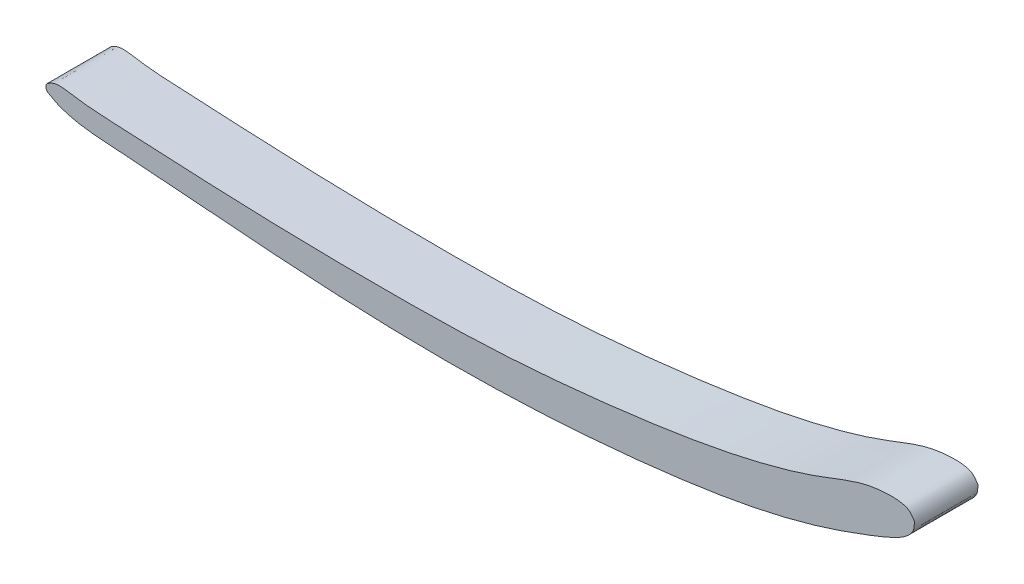
ISO-10303-21;
HEADER;
FILE_DESCRIPTION(('STEP AP214'),'2;1');
FILE_NAME('part.step','',(''),(''),'','','');
FILE_SCHEMA(('AUTOMOTIVE_DESIGN { 1 0 10303 214 1 1 1 1 }'));
ENDSEC;
DATA;
#1=APPLICATION_CONTEXT('core data for automotive mechanical design processes');
#2=APPLICATION_PROTOCOL_DEFINITION('international standard','automotive_design',2000,#1);
#3=PRODUCT_CONTEXT('',#1,'mechanical');
#4=PRODUCT('Part','Part','',(#3));
#5=PRODUCT_RELATED_PRODUCT_CATEGORY('part','',(#4));
#6=PRODUCT_DEFINITION_FORMATION('','',#4);
#7=PRODUCT_DEFINITION_CONTEXT('part definition',#1,'design');
#8=PRODUCT_DEFINITION('design','',#6,#7);
#9=PRODUCT_DEFINITION_SHAPE('','',#8);
#10=(LENGTH_UNIT() NAMED_UNIT(*) SI_UNIT(.MILLI.,.METRE.));
#11=(NAMED_UNIT(*) PLANE_ANGLE_UNIT() SI_UNIT($,.RADIAN.));
#12=(NAMED_UNIT(*) SI_UNIT($,.STERADIAN.) SOLID_ANGLE_UNIT());
#13=UNCERTAINTY_MEASURE_WITH_UNIT(LENGTH_MEASURE(1.E-05),#10,'distance_accuracy_value','');
#14=(GEOMETRIC_REPRESENTATION_CONTEXT(3) GLOBAL_UNCERTAINTY_ASSIGNED_CONTEXT((#13)) GLOBAL_UNIT_ASSIGNED_CONTEXT((#10,
#11,#12)) REPRESENTATION_CONTEXT('',''));
#15=CARTESIAN_POINT('',(0.,0.,0.));
#16=DIRECTION('',(0.,0.,1.));
#17=DIRECTION('',(1.,0.,0.));
#18=AXIS2_PLACEMENT_3D('',#15,#16,#17);
#19=CARTESIAN_POINT('',(39.2107101249076,0.,484.));
#20=CARTESIAN_POINT('',(39.1966892149478,0.0744994993263082,484.));
#21=CARTESIAN_POINT('',(39.1562316590407,0.138319090804084,484.));
#22=CARTESIAN_POINT('',(39.0703347443048,0.260630284760317,484.));
#23=CARTESIAN_POINT('',(39.0237848143283,0.319070404348247,484.));
#24=CARTESIAN_POINT('',(38.8880870892106,0.497370583815167,484.));
#25=CARTESIAN_POINT('',(38.7982872511673,0.617945012896429,484.));
#26=CARTESIAN_POINT('',(38.6452093965495,0.779345719525884,484.));
#27=CARTESIAN_POINT('',(38.5915032725305,0.830090802228872,484.));
#28=CARTESIAN_POINT('',(38.4747754323977,0.920962039986768,484.));
#29=CARTESIAN_POINT('',(38.4116596899818,0.96166063597309,484.));
#30=CARTESIAN_POINT('',(38.213576152383,1.06922299967274,484.));
#31=CARTESIAN_POINT('',(38.0741792380814,1.12009828628752,484.));
#32=CARTESIAN_POINT('',(37.7884118235619,1.20205918468328,484.));
#33=CARTESIAN_POINT('',(37.6413669209037,1.23253707760964,484.));
#34=CARTESIAN_POINT('',(37.348402342913,1.28204351952523,484.));
#35=CARTESIAN_POINT('',(37.2016683670176,1.30074861772526,484.));
#36=CARTESIAN_POINT('',(36.7608035094387,1.34093347904155,484.));
#37=CARTESIAN_POINT('',(36.4660717735677,1.34797450941312,484.));
#38=CARTESIAN_POINT('',(35.5806985864055,1.34079034688117,484.));
#39=CARTESIAN_POINT('',(34.9868344498564,1.2929820434049,484.));
#40=CARTESIAN_POINT('',(33.8223606826979,1.13406301190361,484.));
#41=CARTESIAN_POINT('',(33.2488448021653,1.02005411491131,484.));
#42=CARTESIAN_POINT('',(31.5529642773984,0.580305451016068,484.));
#43=CARTESIAN_POINT('',(30.4527361071637,0.166324137466603,484.));
#44=CARTESIAN_POINT('',(28.2566952339368,-0.676674500100068,484.));
#45=CARTESIAN_POINT('',(27.1582861635171,-1.09688048189664,484.));
#46=CARTESIAN_POINT('',(24.9366697830536,-1.85476622156599,484.));
#47=CARTESIAN_POINT('',(23.8147168674368,-2.19662048686103,484.));
#48=CARTESIAN_POINT('',(21.5560066442277,-2.83106138451655,484.));
#49=CARTESIAN_POINT('',(20.4193296614462,-3.12391533034056,484.));
#50=CARTESIAN_POINT('',(18.1353443383193,-3.67424305758066,484.));
#51=CARTESIAN_POINT('',(16.9869081075183,-3.93026201242336,484.));
#52=CARTESIAN_POINT('',(14.6830237254564,-4.40314981869379,484.));
#53=CARTESIAN_POINT('',(13.5275178329586,-4.62077383124135,484.));
#54=CARTESIAN_POINT('',(10.0528488402235,-5.23059881165078,484.));
#55=CARTESIAN_POINT('',(7.72670971251842,-5.58180834113543,484.));
#56=CARTESIAN_POINT('',(3.06737675596727,-6.2166371996226,484.));
#57=CARTESIAN_POINT('',(0.733006936023503,-6.49849349629658,484.));
#58=CARTESIAN_POINT('',(-3.94390306326162,-7.00043666205528,484.));
#59=CARTESIAN_POINT('',(-6.28559921876976,-7.22060632034208,484.));
#60=CARTESIAN_POINT('',(-10.9759071324191,-7.58063802374168,484.));
#61=CARTESIAN_POINT('',(-13.323045011252,-7.71795290262417,484.));
#62=CARTESIAN_POINT('',(-18.0208983753869,-7.90787918288885,484.));
#63=CARTESIAN_POINT('',(-20.3718961686928,-7.96207679777389,484.));
#64=CARTESIAN_POINT('',(-25.0746237803829,-8.02370895288753,484.));
#65=CARTESIAN_POINT('',(-27.4256594080246,-8.03158361740562,484.));
#66=CARTESIAN_POINT('',(-32.1272992546176,-8.01717516979136,484.));
#67=CARTESIAN_POINT('',(-34.4778991243605,-7.99458802471639,484.));
#68=CARTESIAN_POINT('',(-39.178506252671,-7.90798704137264,484.));
#69=CARTESIAN_POINT('',(-41.5285322433584,-7.84528267853818,484.));
#70=CARTESIAN_POINT('',(-46.2280492219918,-7.68247439755802,484.));
#71=CARTESIAN_POINT('',(-48.5776503223684,-7.5841113475501,484.));
#72=CARTESIAN_POINT('',(-53.2759727165062,-7.37168228432304,484.));
#73=CARTESIAN_POINT('',(-55.6248698802098,-7.25964484015671,484.));
#74=CARTESIAN_POINT('',(-59.1479135583727,-7.08555339602926,484.));
#75=CARTESIAN_POINT('',(-60.3221381970623,-7.02507658041809,484.));
#76=CARTESIAN_POINT('',(-62.0832120252559,-6.92938142464674,484.));
#77=CARTESIAN_POINT('',(-62.670313971126,-6.89876829933132,484.));
#78=CARTESIAN_POINT('',(-63.843876649115,-6.82688567500398,484.));
#79=CARTESIAN_POINT('',(-64.4307159332352,-6.78558512833964,484.));
#80=CARTESIAN_POINT('',(-65.5996269195834,-6.66575239794893,484.));
#81=CARTESIAN_POINT('',(-66.1816473244854,-6.58716981610242,484.));
#82=CARTESIAN_POINT('',(-67.0513434113812,-6.4437351117229,484.));
#83=CARTESIAN_POINT('',(-67.3411695905743,-6.3944391707274,484.));
#84=CARTESIAN_POINT('',(-67.9235695636408,-6.32080670477406,484.));
#85=CARTESIAN_POINT('',(-68.2151163723877,-6.29340025827855,484.));
#86=CARTESIAN_POINT('',(-68.6542919896269,-6.30263037621787,484.));
#87=CARTESIAN_POINT('',(-68.8026862186217,-6.31498472114989,484.));
#88=CARTESIAN_POINT('',(-69.0906644904235,-6.36792942563297,484.));
#89=CARTESIAN_POINT('',(-69.2295109772167,-6.40976423032289,484.));
#90=CARTESIAN_POINT('',(-69.4979470298529,-6.52108670983577,484.));
#91=CARTESIAN_POINT('',(-69.6289048703496,-6.58828177997934,484.));
#92=CARTESIAN_POINT('',(-69.8198169159043,-6.69830648081664,484.));
#93=CARTESIAN_POINT('',(-69.8834270575343,-6.73502547503228,484.));
#94=CARTESIAN_POINT('',(-70.0074703899847,-6.81361231644513,484.));
#95=CARTESIAN_POINT('',(-70.0663552279727,-6.8613333578042,484.));
#96=CARTESIAN_POINT('',(-70.1432948027563,-6.98779597721294,484.));
#97=CARTESIAN_POINT('',(-70.1625574665755,-7.06185415994973,484.));
#98=CARTESIAN_POINT('',(-70.1709904797676,-7.20809112604294,484.));
#99=CARTESIAN_POINT('',(-70.1664338321731,-7.28119792581348,484.));
#100=CARTESIAN_POINT('',(-70.1528928305363,-7.42740562894433,484.));
#101=CARTESIAN_POINT('',(-70.141002396032,-7.50098642769777,484.));
#102=CARTESIAN_POINT('',(-70.0983428651709,-7.60217947046891,484.));
#103=CARTESIAN_POINT('',(-70.0798790516899,-7.63433385878484,484.));
#104=CARTESIAN_POINT('',(-70.0322946399948,-7.69036912131677,484.));
#105=CARTESIAN_POINT('',(-70.0043072892384,-7.7138591895191,484.));
#106=CARTESIAN_POINT('',(-69.9136463920577,-7.77709974093243,484.));
#107=CARTESIAN_POINT('',(-69.8471767243224,-7.8082815208715,484.));
#108=CARTESIAN_POINT('',(-69.7163161979025,-7.87440359074196,484.));
#109=CARTESIAN_POINT('',(-69.6517321649544,-7.90901133050097,484.));
#110=CARTESIAN_POINT('',(-69.4597878125171,-8.01613867421496,484.));
#111=CARTESIAN_POINT('',(-69.3338622944447,-8.09163889469251,484.));
#112=CARTESIAN_POINT('',(-69.079816840562,-8.23806325178785,484.));
#113=CARTESIAN_POINT('',(-68.9511869278637,-8.30753826248205,484.));
#114=CARTESIAN_POINT('',(-68.688345868754,-8.43351031469227,484.));
#115=CARTESIAN_POINT('',(-68.5545104793084,-8.49088109892768,484.));
#116=CARTESIAN_POINT('',(-68.1479707365782,-8.65128894745266,484.));
#117=CARTESIAN_POINT('',(-67.8702469590857,-8.74265441080061,484.));
#118=CARTESIAN_POINT('',(-67.0268436729193,-8.99295857381593,484.));
#119=CARTESIAN_POINT('',(-66.4576994431079,-9.119369382123,484.));
#120=CARTESIAN_POINT('',(-65.314050050554,-9.31340812892518,484.));
#121=CARTESIAN_POINT('',(-64.7388432384422,-9.38285254275342,484.));
#122=CARTESIAN_POINT('',(-63.5856870454911,-9.49938074603048,484.));
#123=CARTESIAN_POINT('',(-63.0075864223424,-9.54523143147917,484.));
#124=CARTESIAN_POINT('',(-61.2718272833174,-9.6709021237071,484.));
#125=CARTESIAN_POINT('',(-60.1130072946647,-9.74082027673979,484.));
#126=CARTESIAN_POINT('',(-57.7966004256389,-9.89297079237469,484.));
#127=CARTESIAN_POINT('',(-56.6386814502981,-9.97307299222001,484.));
#128=CARTESIAN_POINT('',(-53.1660418394861,-10.2291968478754,484.));
#129=CARTESIAN_POINT('',(-50.8523033555559,-10.4188836386456,484.));
#130=CARTESIAN_POINT('',(-46.2239602841667,-10.7860872452803,484.));
#131=CARTESIAN_POINT('',(-43.9093702431199,-10.964113711462,484.));
#132=CARTESIAN_POINT('',(-36.9617293632253,-11.4466268068271,484.));
#133=CARTESIAN_POINT('',(-32.3254289366797,-11.6976723986854,484.));
#134=CARTESIAN_POINT('',(-23.0443210090931,-11.9712418584545,484.));
#135=CARTESIAN_POINT('',(-18.4006606488448,-11.9982471084832,484.));
#136=CARTESIAN_POINT('',(-9.11937555251485,-11.7618436080989,484.));
#137=CARTESIAN_POINT('',(-4.48223211905341,-11.4980641815327,484.));
#138=CARTESIAN_POINT('',(2.45509050174067,-10.9001961649048,484.));
#139=CARTESIAN_POINT('',(4.76586295504765,-10.6674869850366,484.));
#140=CARTESIAN_POINT('',(9.37566715101003,-10.1261303622318,484.));
#141=CARTESIAN_POINT('',(11.6754404230439,-9.81888774432259,484.));
#142=CARTESIAN_POINT('',(16.2594461397363,-9.09360920388509,484.));
#143=CARTESIAN_POINT('',(18.5457844774243,-8.67489389700604,484.));
#144=CARTESIAN_POINT('',(23.0790184734787,-7.67276683889543,484.));
#145=CARTESIAN_POINT('',(25.3286947149999,-7.08736777071937,484.));
#146=CARTESIAN_POINT('',(29.7675751825288,-5.72141129032543,484.));
#147=CARTESIAN_POINT('',(31.9581428313653,-4.94234002278944,484.));
#148=CARTESIAN_POINT('',(34.6597588290514,-3.87798738787721,484.));
#149=CARTESIAN_POINT('',(35.1984161674538,-3.6605669740215,484.));
#150=CARTESIAN_POINT('',(35.9984470636816,-3.31588226391413,484.));
#151=CARTESIAN_POINT('',(36.2634477517821,-3.19736829054491,484.));
#152=CARTESIAN_POINT('',(36.7876689521292,-2.94786098796371,484.));
#153=CARTESIAN_POINT('',(37.0477944344752,-2.81714422919707,484.));
#154=CARTESIAN_POINT('',(37.5527105716555,-2.53335638833138,484.));
#155=CARTESIAN_POINT('',(37.7975968001387,-2.38040001372276,484.));
#156=CARTESIAN_POINT('',(38.1456275510391,-2.12277021991112,484.));
#157=CARTESIAN_POINT('',(38.2583217685067,-2.0320488998539,484.));
#158=CARTESIAN_POINT('',(38.4746986579882,-1.83744039685459,484.));
#159=CARTESIAN_POINT('',(38.5784390822163,-1.73315107929713,484.));
#160=CARTESIAN_POINT('',(38.7706648827758,-1.51415368408954,484.));
#161=CARTESIAN_POINT('',(38.8597561060177,-1.39895433101523,484.));
#162=CARTESIAN_POINT('',(39.0137155112562,-1.1488897798211,484.));
#163=CARTESIAN_POINT('',(39.0768548343833,-1.01743453471305,484.));
#164=CARTESIAN_POINT('',(39.1528582829853,-0.736777138339785,484.));
#165=CARTESIAN_POINT('',(39.1634649767512,-0.587557521425829,484.));
#166=CARTESIAN_POINT('',(39.1818384174239,-0.367282056085924,484.));
#167=CARTESIAN_POINT('',(39.1911635179217,-0.29414261321152,484.));
#168=CARTESIAN_POINT('',(39.2114011149196,-0.148005430766207,484.));
#169=CARTESIAN_POINT('',(39.2247310348675,-0.0744994993263082,484.));
#170=CARTESIAN_POINT('',(39.2107101249076,0.,484.));
#171=B_SPLINE_CURVE_WITH_KNOTS('',3,(#19,#20,#21,#22,#23,#24,#25,#26,#27,#28,#29,#30,#31,#32,
#33,#34,#35,#36,#37,#38,#39,#40,#41,#42,#43,#44,#45,#46,#47,#48,#49,#50,#51,#52,#53,#54,#55,#56,
#57,#58,#59,#60,#61,#62,#63,#64,#65,#66,#67,#68,#69,#70,#71,#72,#73,#74,#75,#76,#77,#78,#79,#80,
#81,#82,#83,#84,#85,#86,#87,#88,#89,#90,#91,#92,#93,#94,#95,#96,#97,#98,#99,#100,#101,#102,#103,
#104,#105,#106,#107,#108,#109,#110,#111,#112,#113,#114,#115,#116,#117,#118,#119,#120,#121,#122,
#123,#124,#125,#126,#127,#128,#129,#130,#131,#132,#133,#134,#135,#136,#137,#138,#139,#140,#141,
#142,#143,#144,#145,#146,#147,#148,#149,#150,#151,#152,#153,#154,#155,#156,#157,#158,#159,#160,
#161,#162,#163,#164,#165,#166,#167,#168,#169,#170),.UNSPECIFIED.,.T.,.F.,(4,2,2,2,2,2,2,2,2,2,2,
2,2,2,2,2,2,2,2,2,2,2,2,2,2,2,2,2,2,2,2,2,2,2,2,2,2,2,2,2,2,2,2,2,2,2,2,2,2,2,2,2,2,2,2,2,2,2,2,
2,2,2,2,2,2,2,2,2,2,2,2,2,2,2,2,4),(0.,0.000976562500000028,0.00195312500000006,
0.00390625000000011,0.00488281250000014,0.00585937500000017,0.00781250000000023,
0.00976562500000028,0.0117187500000003,0.0156250000000005,0.0234375000000006,0.0312500000000007,
0.0468750000000011,0.0625000000000014,0.0781250000000018,0.0937500000000022,0.109375000000003,
0.125000000000003,0.156250000000004,0.187500000000004,0.218750000000005,0.250000000000006,
0.281250000000007,0.312500000000008,0.343750000000008,0.375000000000009,0.40625000000001,
0.437500000000011,0.453125000000011,0.460937500000012,0.468750000000012,0.476562500000012,
0.480468750000012,0.484375000000012,0.486328125000012,0.488281250000012,0.490234375000013,
0.491210937500013,0.492187500000013,0.493164062500013,0.494140625000013,0.495117187500013,
0.495605468750013,0.496093750000013,0.497070312500013,0.498046875000013,0.500000000000013,
0.501953125000013,0.503906250000013,0.507812500000013,0.515625000000013,0.523437500000013,
0.531250000000013,0.546875000000012,0.562500000000012,0.593750000000011,0.62500000000001,
0.687500000000008,0.750000000000007,0.812500000000005,0.843750000000004,0.875000000000003,
0.906250000000003,0.937500000000002,0.968750000000001,0.976562500000001,0.980468750000001,
0.984375,0.98828125,0.990234375,0.9921875,0.994140625,0.99609375,0.998046875,0.9990234375,1.),.UNSPECIFIED.);
#172=DIRECTION('',(0.,0.,-1.));
#173=VECTOR('',#172,1.);
#174=SURFACE_OF_LINEAR_EXTRUSION('',#171,#173);
#175=CARTESIAN_POINT('',(39.2107101249076,0.,484.));
#176=CARTESIAN_POINT('',(39.2247310348675,-0.0744994993263082,484.));
#177=CARTESIAN_POINT('',(39.2114011149196,-0.148005430766207,484.));
#178=CARTESIAN_POINT('',(39.1911635179217,-0.29414261321152,484.));
#179=CARTESIAN_POINT('',(39.1818384174239,-0.367282056085924,484.));
#180=CARTESIAN_POINT('',(39.1634649767512,-0.587557521425829,484.));
#181=CARTESIAN_POINT('',(39.1528582829853,-0.736777138339785,484.));
#182=CARTESIAN_POINT('',(39.0768548343833,-1.01743453471305,484.));
#183=CARTESIAN_POINT('',(39.0137155112562,-1.1488897798211,484.));
#184=CARTESIAN_POINT('',(38.8597561060177,-1.39895433101523,484.));
#185=CARTESIAN_POINT('',(38.7706648827758,-1.51415368408954,484.));
#186=CARTESIAN_POINT('',(38.5784390822163,-1.73315107929713,484.));
#187=CARTESIAN_POINT('',(38.4746986579882,-1.83744039685459,484.));
#188=CARTESIAN_POINT('',(38.2583217685067,-2.0320488998539,484.));
#189=CARTESIAN_POINT('',(38.1456275510391,-2.12277021991112,484.));
#190=CARTESIAN_POINT('',(37.7975968001387,-2.38040001372276,484.));
#191=CARTESIAN_POINT('',(37.5527105716555,-2.53335638833138,484.));
#192=CARTESIAN_POINT('',(37.0477944344752,-2.81714422919707,484.));
#193=CARTESIAN_POINT('',(36.7876689521292,-2.94786098796371,484.));
#194=CARTESIAN_POINT('',(36.2634477517821,-3.19736829054491,484.));
#195=CARTESIAN_POINT('',(35.9984470636816,-3.31588226391413,484.));
#196=CARTESIAN_POINT('',(35.1984161674538,-3.6605669740215,484.));
#197=CARTESIAN_POINT('',(34.6597588290514,-3.87798738787721,484.));
#198=CARTESIAN_POINT('',(31.9581428313653,-4.94234002278944,484.));
#199=CARTESIAN_POINT('',(29.7675751825288,-5.72141129032543,484.));
#200=CARTESIAN_POINT('',(25.3286947149999,-7.08736777071937,484.));
#201=CARTESIAN_POINT('',(23.0790184734787,-7.67276683889543,484.));
#202=CARTESIAN_POINT('',(18.5457844774243,-8.67489389700604,484.));
#203=CARTESIAN_POINT('',(16.2594461397363,-9.09360920388509,484.));
#204=CARTESIAN_POINT('',(11.6754404230439,-9.81888774432259,484.));
#205=CARTESIAN_POINT('',(9.37566715101003,-10.1261303622318,484.));
#206=CARTESIAN_POINT('',(4.76586295504765,-10.6674869850366,484.));
#207=CARTESIAN_POINT('',(2.45509050174067,-10.9001961649048,484.));
#208=CARTESIAN_POINT('',(-4.48223211905341,-11.4980641815327,484.));
#209=CARTESIAN_POINT('',(-9.11937555251485,-11.7618436080989,484.));
#210=CARTESIAN_POINT('',(-18.4006606488448,-11.9982471084832,484.));
#211=CARTESIAN_POINT('',(-23.0443210090931,-11.9712418584545,484.));
#212=CARTESIAN_POINT('',(-32.3254289366797,-11.6976723986854,484.));
#213=CARTESIAN_POINT('',(-36.9617293632253,-11.4466268068271,484.));
#214=CARTESIAN_POINT('',(-43.9093702431199,-10.964113711462,484.));
#215=CARTESIAN_POINT('',(-46.2239602841667,-10.7860872452803,484.));
#216=CARTESIAN_POINT('',(-50.8523033555559,-10.4188836386456,484.));
#217=CARTESIAN_POINT('',(-53.1660418394861,-10.2291968478754,484.));
#218=CARTESIAN_POINT('',(-56.6386814502981,-9.97307299222001,484.));
#219=CARTESIAN_POINT('',(-57.7966004256389,-9.89297079237469,484.));
#220=CARTESIAN_POINT('',(-60.1130072946647,-9.74082027673979,484.));
#221=CARTESIAN_POINT('',(-61.2718272833174,-9.6709021237071,484.));
#222=CARTESIAN_POINT('',(-63.0075864223424,-9.54523143147917,484.));
#223=CARTESIAN_POINT('',(-63.5856870454911,-9.49938074603048,484.));
#224=CARTESIAN_POINT('',(-64.7388432384422,-9.38285254275342,484.));
#225=CARTESIAN_POINT('',(-65.314050050554,-9.31340812892518,484.));
#226=CARTESIAN_POINT('',(-66.4576994431079,-9.119369382123,484.));
#227=CARTESIAN_POINT('',(-67.0268436729193,-8.99295857381593,484.));
#228=CARTESIAN_POINT('',(-67.8702469590857,-8.74265441080061,484.));
#229=CARTESIAN_POINT('',(-68.1479707365782,-8.65128894745266,484.));
#230=CARTESIAN_POINT('',(-68.5545104793084,-8.49088109892768,484.));
#231=CARTESIAN_POINT('',(-68.688345868754,-8.43351031469227,484.));
#232=CARTESIAN_POINT('',(-68.9511869278637,-8.30753826248205,484.));
#233=CARTESIAN_POINT('',(-69.079816840562,-8.23806325178785,484.));
#234=CARTESIAN_POINT('',(-69.3338622944447,-8.09163889469251,484.));
#235=CARTESIAN_POINT('',(-69.4597878125171,-8.01613867421496,484.));
#236=CARTESIAN_POINT('',(-69.6517321649544,-7.90901133050097,484.));
#237=CARTESIAN_POINT('',(-69.7163161979025,-7.87440359074196,484.));
#238=CARTESIAN_POINT('',(-69.8471767243224,-7.8082815208715,484.));
#239=CARTESIAN_POINT('',(-69.9136463920577,-7.77709974093243,484.));
#240=CARTESIAN_POINT('',(-70.0043072892384,-7.7138591895191,484.));
#241=CARTESIAN_POINT('',(-70.0322946399948,-7.69036912131677,484.));
#242=CARTESIAN_POINT('',(-70.0798790516899,-7.63433385878484,484.));
#243=CARTESIAN_POINT('',(-70.0983428651709,-7.60217947046891,484.));
#244=CARTESIAN_POINT('',(-70.141002396032,-7.50098642769777,484.));
#245=CARTESIAN_POINT('',(-70.1528928305363,-7.42740562894433,484.));
#246=CARTESIAN_POINT('',(-70.1664338321731,-7.28119792581348,484.));
#247=CARTESIAN_POINT('',(-70.1709904797676,-7.20809112604294,484.));
#248=CARTESIAN_POINT('',(-70.1625574665755,-7.06185415994973,484.));
#249=CARTESIAN_POINT('',(-70.1432948027563,-6.98779597721294,484.));
#250=CARTESIAN_POINT('',(-70.0663552279727,-6.8613333578042,484.));
#251=CARTESIAN_POINT('',(-70.0074703899847,-6.81361231644513,484.));
#252=CARTESIAN_POINT('',(-69.8834270575343,-6.73502547503228,484.));
#253=CARTESIAN_POINT('',(-69.8198169159043,-6.69830648081664,484.));
#254=CARTESIAN_POINT('',(-69.6289048703496,-6.58828177997934,484.));
#255=CARTESIAN_POINT('',(-69.4979470298529,-6.52108670983577,484.));
#256=CARTESIAN_POINT('',(-69.2295109772167,-6.40976423032289,484.));
#257=CARTESIAN_POINT('',(-69.0906644904235,-6.36792942563297,484.));
#258=CARTESIAN_POINT('',(-68.8026862186217,-6.31498472114989,484.));
#259=CARTESIAN_POINT('',(-68.6542919896269,-6.30263037621787,484.));
#260=CARTESIAN_POINT('',(-68.2151163723877,-6.29340025827855,484.));
#261=CARTESIAN_POINT('',(-67.9235695636408,-6.32080670477406,484.));
#262=CARTESIAN_POINT('',(-67.3411695905743,-6.3944391707274,484.));
#263=CARTESIAN_POINT('',(-67.0513434113812,-6.4437351117229,484.));
#264=CARTESIAN_POINT('',(-66.1816473244854,-6.58716981610242,484.));
#265=CARTESIAN_POINT('',(-65.5996269195834,-6.66575239794893,484.));
#266=CARTESIAN_POINT('',(-64.4307159332352,-6.78558512833964,484.));
#267=CARTESIAN_POINT('',(-63.843876649115,-6.82688567500398,484.));
#268=CARTESIAN_POINT('',(-62.670313971126,-6.89876829933132,484.));
#269=CARTESIAN_POINT('',(-62.0832120252559,-6.92938142464674,484.));
#270=CARTESIAN_POINT('',(-60.3221381970623,-7.02507658041809,484.));
#271=CARTESIAN_POINT('',(-59.1479135583727,-7.08555339602926,484.));
#272=CARTESIAN_POINT('',(-55.6248698802098,-7.25964484015671,484.));
#273=CARTESIAN_POINT('',(-53.2759727165062,-7.37168228432304,484.));
#274=CARTESIAN_POINT('',(-48.5776503223684,-7.5841113475501,484.));
#275=CARTESIAN_POINT('',(-46.2280492219918,-7.68247439755802,484.));
#276=CARTESIAN_POINT('',(-41.5285322433584,-7.84528267853818,484.));
#277=CARTESIAN_POINT('',(-39.178506252671,-7.90798704137264,484.));
#278=CARTESIAN_POINT('',(-34.4778991243605,-7.99458802471639,484.));
#279=CARTESIAN_POINT('',(-32.1272992546176,-8.01717516979136,484.));
#280=CARTESIAN_POINT('',(-27.4256594080246,-8.03158361740562,484.));
#281=CARTESIAN_POINT('',(-25.0746237803829,-8.02370895288753,484.));
#282=CARTESIAN_POINT('',(-20.3718961686928,-7.96207679777389,484.));
#283=CARTESIAN_POINT('',(-18.0208983753869,-7.90787918288885,484.));
#284=CARTESIAN_POINT('',(-13.323045011252,-7.71795290262417,484.));
#285=CARTESIAN_POINT('',(-10.9759071324191,-7.58063802374168,484.));
#286=CARTESIAN_POINT('',(-6.28559921876976,-7.22060632034208,484.));
#287=CARTESIAN_POINT('',(-3.94390306326162,-7.00043666205528,484.));
#288=CARTESIAN_POINT('',(0.733006936023503,-6.49849349629658,484.));
#289=CARTESIAN_POINT('',(3.06737675596727,-6.2166371996226,484.));
#290=CARTESIAN_POINT('',(7.72670971251842,-5.58180834113543,484.));
#291=CARTESIAN_POINT('',(10.0528488402235,-5.23059881165078,484.));
#292=CARTESIAN_POINT('',(13.5275178329586,-4.62077383124135,484.));
#293=CARTESIAN_POINT('',(14.6830237254564,-4.40314981869379,484.));
#294=CARTESIAN_POINT('',(16.9869081075183,-3.93026201242336,484.));
#295=CARTESIAN_POINT('',(18.1353443383193,-3.67424305758066,484.));
#296=CARTESIAN_POINT('',(20.4193296614462,-3.12391533034056,484.));
#297=CARTESIAN_POINT('',(21.5560066442277,-2.83106138451655,484.));
#298=CARTESIAN_POINT('',(23.8147168674368,-2.19662048686103,484.));
#299=CARTESIAN_POINT('',(24.9366697830536,-1.85476622156599,484.));
#300=CARTESIAN_POINT('',(27.1582861635171,-1.09688048189664,484.));
#301=CARTESIAN_POINT('',(28.2566952339368,-0.676674500100068,484.));
#302=CARTESIAN_POINT('',(30.4527361071637,0.166324137466603,484.));
#303=CARTESIAN_POINT('',(31.5529642773984,0.580305451016068,484.));
#304=CARTESIAN_POINT('',(33.2488448021653,1.02005411491131,484.));
#305=CARTESIAN_POINT('',(33.8223606826979,1.13406301190361,484.));
#306=CARTESIAN_POINT('',(34.9868344498564,1.2929820434049,484.));
#307=CARTESIAN_POINT('',(35.5806985864055,1.34079034688117,484.));
#308=CARTESIAN_POINT('',(36.4660717735677,1.34797450941312,484.));
#309=CARTESIAN_POINT('',(36.7608035094387,1.34093347904155,484.));
#310=CARTESIAN_POINT('',(37.2016683670176,1.30074861772526,484.));
#311=CARTESIAN_POINT('',(37.348402342913,1.28204351952523,484.));
#312=CARTESIAN_POINT('',(37.6413669209037,1.23253707760964,484.));
#313=CARTESIAN_POINT('',(37.7884118235619,1.20205918468328,484.));
#314=CARTESIAN_POINT('',(38.0741792380814,1.12009828628752,484.));
#315=CARTESIAN_POINT('',(38.213576152383,1.06922299967274,484.));
#316=CARTESIAN_POINT('',(38.4116596899818,0.96166063597309,484.));
#317=CARTESIAN_POINT('',(38.4747754323977,0.920962039986768,484.));
#318=CARTESIAN_POINT('',(38.5915032725305,0.830090802228872,484.));
#319=CARTESIAN_POINT('',(38.6452093965495,0.779345719525884,484.));
#320=CARTESIAN_POINT('',(38.7982872511673,0.617945012896429,484.));
#321=CARTESIAN_POINT('',(38.8880870892106,0.497370583815167,484.));
#322=CARTESIAN_POINT('',(39.0237848143283,0.319070404348247,484.));
#323=CARTESIAN_POINT('',(39.0703347443048,0.260630284760317,484.));
#324=CARTESIAN_POINT('',(39.1562316590407,0.138319090804084,484.));
#325=CARTESIAN_POINT('',(39.1966892149478,0.0744994993263082,484.));
#326=CARTESIAN_POINT('',(39.2107101249076,0.,484.));
#327=B_SPLINE_CURVE_WITH_KNOTS('',3,(#175,#176,#177,#178,#179,#180,#181,#182,#183,#184,#185,
#186,#187,#188,#189,#190,#191,#192,#193,#194,#195,#196,#197,#198,#199,#200,#201,#202,#203,#204,
#205,#206,#207,#208,#209,#210,#211,#212,#213,#214,#215,#216,#217,#218,#219,#220,#221,#222,#223,
#224,#225,#226,#227,#228,#229,#230,#231,#232,#233,#234,#235,#236,#237,#238,#239,#240,#241,#242,
#243,#244,#245,#246,#247,#248,#249,#250,#251,#252,#253,#254,#255,#256,#257,#258,#259,#260,#261,
#262,#263,#264,#265,#266,#267,#268,#269,#270,#271,#272,#273,#274,#275,#276,#277,#278,#279,#280,
#281,#282,#283,#284,#285,#286,#287,#288,#289,#290,#291,#292,#293,#294,#295,#296,#297,#298,#299,
#300,#301,#302,#303,#304,#305,#306,#307,#308,#309,#310,#311,#312,#313,#314,#315,#316,#317,#318,
#319,#320,#321,#322,#323,#324,#325,#326),.UNSPECIFIED.,.T.,.F.,(4,2,2,2,2,2,2,2,2,2,2,2,2,2,2,2,
2,2,2,2,2,2,2,2,2,2,2,2,2,2,2,2,2,2,2,2,2,2,2,2,2,2,2,2,2,2,2,2,2,2,2,2,2,2,2,2,2,2,2,2,2,2,2,2,
2,2,2,2,2,2,2,2,2,2,2,4),(0.,0.000976562499999889,0.001953125,0.00390624999999989,
0.00585937499999989,0.00781249999999978,0.00976562499999978,0.0117187499999997,
0.0156249999999996,0.0195312499999994,0.0234374999999993,0.0312499999999991,0.0624999999999982,
0.0937499999999974,0.124999999999997,0.156249999999996,0.187499999999995,0.249999999999993,
0.312499999999992,0.37499999999999,0.406249999999989,0.437499999999988,0.453124999999988,
0.468749999999987,0.476562499999987,0.484374999999987,0.492187499999987,0.496093749999987,
0.498046874999987,0.499999999999987,0.501953124999987,0.502929687499987,0.503906249999987,
0.504394531249987,0.504882812499987,0.505859374999987,0.506835937499987,0.507812499999987,
0.508789062499987,0.509765624999987,0.511718749999988,0.513671874999988,0.515624999999988,
0.519531249999988,0.523437499999988,0.531249999999988,0.539062499999988,0.546874999999989,
0.562499999999989,0.59374999999999,0.624999999999991,0.656249999999992,0.687499999999992,
0.718749999999993,0.749999999999994,0.781249999999995,0.812499999999996,0.843749999999996,
0.874999999999997,0.890624999999997,0.906249999999998,0.921874999999998,0.937499999999999,
0.953124999999999,0.968749999999999,0.976562499999999,0.984375,0.98828125,0.990234375,0.9921875,
0.994140625,0.9951171875,0.99609375,0.998046875,0.9990234375,1.),.UNSPECIFIED.);
#328=CARTESIAN_POINT('',(39.2107101249076,0.,484.));
#329=VERTEX_POINT('',#328);
#330=EDGE_CURVE('E10',#329,#329,#327,.F.);
#331=ORIENTED_EDGE('',*,*,#330,.F.);
#332=EDGE_LOOP('',(#331));
#333=FACE_BOUND('',#332,.T.);
#334=CARTESIAN_POINT('',(39.2107101249076,0.,476.));
#335=CARTESIAN_POINT('',(39.1966892149478,0.0744994993263082,476.));
#336=CARTESIAN_POINT('',(39.1562316590407,0.138319090804084,476.));
#337=CARTESIAN_POINT('',(39.0703347443048,0.260630284760317,476.));
#338=CARTESIAN_POINT('',(39.0237848143283,0.319070404348247,476.));
#339=CARTESIAN_POINT('',(38.8880870892106,0.497370583815167,476.));
#340=CARTESIAN_POINT('',(38.7982872511673,0.617945012896429,476.));
#341=CARTESIAN_POINT('',(38.6452093965495,0.779345719525884,476.));
#342=CARTESIAN_POINT('',(38.5915032725305,0.830090802228872,476.));
#343=CARTESIAN_POINT('',(38.4747754323977,0.920962039986768,476.));
#344=CARTESIAN_POINT('',(38.4116596899818,0.96166063597309,476.));
#345=CARTESIAN_POINT('',(38.213576152383,1.06922299967274,476.));
#346=CARTESIAN_POINT('',(38.0741792380814,1.12009828628752,476.));
#347=CARTESIAN_POINT('',(37.7884118235619,1.20205918468328,476.));
#348=CARTESIAN_POINT('',(37.6413669209037,1.23253707760964,476.));
#349=CARTESIAN_POINT('',(37.348402342913,1.28204351952523,476.));
#350=CARTESIAN_POINT('',(37.2016683670176,1.30074861772526,476.));
#351=CARTESIAN_POINT('',(36.7608035094387,1.34093347904155,476.));
#352=CARTESIAN_POINT('',(36.4660717735677,1.34797450941312,476.));
#353=CARTESIAN_POINT('',(35.5806985864055,1.34079034688117,476.));
#354=CARTESIAN_POINT('',(34.9868344498564,1.2929820434049,476.));
#355=CARTESIAN_POINT('',(33.8223606826979,1.13406301190361,476.));
#356=CARTESIAN_POINT('',(33.2488448021653,1.02005411491131,476.));
#357=CARTESIAN_POINT('',(31.5529642773984,0.580305451016068,476.));
#358=CARTESIAN_POINT('',(30.4527361071637,0.166324137466603,476.));
#359=CARTESIAN_POINT('',(28.2566952339368,-0.676674500100068,476.));
#360=CARTESIAN_POINT('',(27.1582861635171,-1.09688048189664,476.));
#361=CARTESIAN_POINT('',(24.9366697830536,-1.85476622156599,476.));
#362=CARTESIAN_POINT('',(23.8147168674368,-2.19662048686103,476.));
#363=CARTESIAN_POINT('',(21.5560066442277,-2.83106138451655,476.));
#364=CARTESIAN_POINT('',(20.4193296614462,-3.12391533034056,476.));
#365=CARTESIAN_POINT('',(18.1353443383193,-3.67424305758066,476.));
#366=CARTESIAN_POINT('',(16.9869081075183,-3.93026201242336,476.));
#367=CARTESIAN_POINT('',(14.6830237254564,-4.40314981869379,476.));
#368=CARTESIAN_POINT('',(13.5275178329586,-4.62077383124135,476.));
#369=CARTESIAN_POINT('',(10.0528488402235,-5.23059881165078,476.));
#370=CARTESIAN_POINT('',(7.72670971251842,-5.58180834113543,476.));
#371=CARTESIAN_POINT('',(3.06737675596727,-6.2166371996226,476.));
#372=CARTESIAN_POINT('',(0.733006936023503,-6.49849349629658,476.));
#373=CARTESIAN_POINT('',(-3.94390306326162,-7.00043666205528,476.));
#374=CARTESIAN_POINT('',(-6.28559921876976,-7.22060632034208,476.));
#375=CARTESIAN_POINT('',(-10.9759071324191,-7.58063802374168,476.));
#376=CARTESIAN_POINT('',(-13.323045011252,-7.71795290262417,476.));
#377=CARTESIAN_POINT('',(-18.0208983753869,-7.90787918288885,476.));
#378=CARTESIAN_POINT('',(-20.3718961686928,-7.96207679777389,476.));
#379=CARTESIAN_POINT('',(-25.0746237803829,-8.02370895288753,476.));
#380=CARTESIAN_POINT('',(-27.4256594080246,-8.03158361740562,476.));
#381=CARTESIAN_POINT('',(-32.1272992546176,-8.01717516979136,476.));
#382=CARTESIAN_POINT('',(-34.4778991243605,-7.99458802471639,476.));
#383=CARTESIAN_POINT('',(-39.178506252671,-7.90798704137264,476.));
#384=CARTESIAN_POINT('',(-41.5285322433584,-7.84528267853818,476.));
#385=CARTESIAN_POINT('',(-46.2280492219918,-7.68247439755802,476.));
#386=CARTESIAN_POINT('',(-48.5776503223684,-7.5841113475501,476.));
#387=CARTESIAN_POINT('',(-53.2759727165062,-7.37168228432304,476.));
#388=CARTESIAN_POINT('',(-55.6248698802098,-7.25964484015671,476.));
#389=CARTESIAN_POINT('',(-59.1479135583727,-7.08555339602926,476.));
#390=CARTESIAN_POINT('',(-60.3221381970623,-7.02507658041809,476.));
#391=CARTESIAN_POINT('',(-62.0832120252559,-6.92938142464674,476.));
#392=CARTESIAN_POINT('',(-62.670313971126,-6.89876829933132,476.));
#393=CARTESIAN_POINT('',(-63.843876649115,-6.82688567500398,476.));
#394=CARTESIAN_POINT('',(-64.4307159332352,-6.78558512833964,476.));
#395=CARTESIAN_POINT('',(-65.5996269195834,-6.66575239794893,476.));
#396=CARTESIAN_POINT('',(-66.1816473244854,-6.58716981610242,476.));
#397=CARTESIAN_POINT('',(-67.0513434113812,-6.4437351117229,476.));
#398=CARTESIAN_POINT('',(-67.3411695905743,-6.3944391707274,476.));
#399=CARTESIAN_POINT('',(-67.9235695636408,-6.32080670477406,476.));
#400=CARTESIAN_POINT('',(-68.2151163723877,-6.29340025827855,476.));
#401=CARTESIAN_POINT('',(-68.6542919896269,-6.30263037621787,476.));
#402=CARTESIAN_POINT('',(-68.8026862186217,-6.31498472114989,476.));
#403=CARTESIAN_POINT('',(-69.0906644904235,-6.36792942563297,476.));
#404=CARTESIAN_POINT('',(-69.2295109772167,-6.40976423032289,476.));
#405=CARTESIAN_POINT('',(-69.4979470298529,-6.52108670983577,476.));
#406=CARTESIAN_POINT('',(-69.6289048703496,-6.58828177997934,476.));
#407=CARTESIAN_POINT('',(-69.8198169159043,-6.69830648081664,476.));
#408=CARTESIAN_POINT('',(-69.8834270575343,-6.73502547503228,476.));
#409=CARTESIAN_POINT('',(-70.0074703899847,-6.81361231644513,476.));
#410=CARTESIAN_POINT('',(-70.0663552279727,-6.8613333578042,476.));
#411=CARTESIAN_POINT('',(-70.1432948027563,-6.98779597721294,476.));
#412=CARTESIAN_POINT('',(-70.1625574665755,-7.06185415994973,476.));
#413=CARTESIAN_POINT('',(-70.1709904797676,-7.20809112604294,476.));
#414=CARTESIAN_POINT('',(-70.1664338321731,-7.28119792581348,476.));
#415=CARTESIAN_POINT('',(-70.1528928305363,-7.42740562894433,476.));
#416=CARTESIAN_POINT('',(-70.141002396032,-7.50098642769777,476.));
#417=CARTESIAN_POINT('',(-70.0983428651709,-7.60217947046891,476.));
#418=CARTESIAN_POINT('',(-70.0798790516899,-7.63433385878484,476.));
#419=CARTESIAN_POINT('',(-70.0322946399948,-7.69036912131677,476.));
#420=CARTESIAN_POINT('',(-70.0043072892384,-7.7138591895191,476.));
#421=CARTESIAN_POINT('',(-69.9136463920577,-7.77709974093243,476.));
#422=CARTESIAN_POINT('',(-69.8471767243224,-7.8082815208715,476.));
#423=CARTESIAN_POINT('',(-69.7163161979025,-7.87440359074196,476.));
#424=CARTESIAN_POINT('',(-69.6517321649544,-7.90901133050097,476.));
#425=CARTESIAN_POINT('',(-69.4597878125171,-8.01613867421496,476.));
#426=CARTESIAN_POINT('',(-69.3338622944447,-8.09163889469251,476.));
#427=CARTESIAN_POINT('',(-69.079816840562,-8.23806325178785,476.));
#428=CARTESIAN_POINT('',(-68.9511869278637,-8.30753826248205,476.));
#429=CARTESIAN_POINT('',(-68.688345868754,-8.43351031469227,476.));
#430=CARTESIAN_POINT('',(-68.5545104793084,-8.49088109892768,476.));
#431=CARTESIAN_POINT('',(-68.1479707365782,-8.65128894745266,476.));
#432=CARTESIAN_POINT('',(-67.8702469590857,-8.74265441080061,476.));
#433=CARTESIAN_POINT('',(-67.0268436729193,-8.99295857381593,476.));
#434=CARTESIAN_POINT('',(-66.4576994431079,-9.119369382123,476.));
#435=CARTESIAN_POINT('',(-65.314050050554,-9.31340812892518,476.));
#436=CARTESIAN_POINT('',(-64.7388432384422,-9.38285254275342,476.));
#437=CARTESIAN_POINT('',(-63.5856870454911,-9.49938074603048,476.));
#438=CARTESIAN_POINT('',(-63.0075864223424,-9.54523143147917,476.));
#439=CARTESIAN_POINT('',(-61.2718272833174,-9.6709021237071,476.));
#440=CARTESIAN_POINT('',(-60.1130072946647,-9.74082027673979,476.));
#441=CARTESIAN_POINT('',(-57.7966004256389,-9.89297079237469,476.));
#442=CARTESIAN_POINT('',(-56.6386814502981,-9.97307299222001,476.));
#443=CARTESIAN_POINT('',(-53.1660418394861,-10.2291968478754,476.));
#444=CARTESIAN_POINT('',(-50.8523033555559,-10.4188836386456,476.));
#445=CARTESIAN_POINT('',(-46.2239602841667,-10.7860872452803,476.));
#446=CARTESIAN_POINT('',(-43.9093702431199,-10.964113711462,476.));
#447=CARTESIAN_POINT('',(-36.9617293632253,-11.4466268068271,476.));
#448=CARTESIAN_POINT('',(-32.3254289366797,-11.6976723986854,476.));
#449=CARTESIAN_POINT('',(-23.0443210090931,-11.9712418584545,476.));
#450=CARTESIAN_POINT('',(-18.4006606488448,-11.9982471084832,476.));
#451=CARTESIAN_POINT('',(-9.11937555251485,-11.7618436080989,476.));
#452=CARTESIAN_POINT('',(-4.48223211905341,-11.4980641815327,476.));
#453=CARTESIAN_POINT('',(2.45509050174067,-10.9001961649048,476.));
#454=CARTESIAN_POINT('',(4.76586295504765,-10.6674869850366,476.));
#455=CARTESIAN_POINT('',(9.37566715101003,-10.1261303622318,476.));
#456=CARTESIAN_POINT('',(11.6754404230439,-9.81888774432259,476.));
#457=CARTESIAN_POINT('',(16.2594461397363,-9.09360920388509,476.));
#458=CARTESIAN_POINT('',(18.5457844774243,-8.67489389700604,476.));
#459=CARTESIAN_POINT('',(23.0790184734787,-7.67276683889543,476.));
#460=CARTESIAN_POINT('',(25.3286947149999,-7.08736777071937,476.));
#461=CARTESIAN_POINT('',(29.7675751825288,-5.72141129032543,476.));
#462=CARTESIAN_POINT('',(31.9581428313653,-4.94234002278944,476.));
#463=CARTESIAN_POINT('',(34.6597588290514,-3.87798738787721,476.));
#464=CARTESIAN_POINT('',(35.1984161674538,-3.6605669740215,476.));
#465=CARTESIAN_POINT('',(35.9984470636816,-3.31588226391413,476.));
#466=CARTESIAN_POINT('',(36.2634477517821,-3.19736829054491,476.));
#467=CARTESIAN_POINT('',(36.7876689521292,-2.94786098796371,476.));
#468=CARTESIAN_POINT('',(37.0477944344752,-2.81714422919707,476.));
#469=CARTESIAN_POINT('',(37.5527105716555,-2.53335638833138,476.));
#470=CARTESIAN_POINT('',(37.7975968001387,-2.38040001372276,476.));
#471=CARTESIAN_POINT('',(38.1456275510391,-2.12277021991112,476.));
#472=CARTESIAN_POINT('',(38.2583217685067,-2.0320488998539,476.));
#473=CARTESIAN_POINT('',(38.4746986579882,-1.83744039685459,476.));
#474=CARTESIAN_POINT('',(38.5784390822163,-1.73315107929713,476.));
#475=CARTESIAN_POINT('',(38.7706648827758,-1.51415368408954,476.));
#476=CARTESIAN_POINT('',(38.8597561060177,-1.39895433101523,476.));
#477=CARTESIAN_POINT('',(39.0137155112562,-1.1488897798211,476.));
#478=CARTESIAN_POINT('',(39.0768548343833,-1.01743453471305,476.));
#479=CARTESIAN_POINT('',(39.1528582829853,-0.736777138339785,476.));
#480=CARTESIAN_POINT('',(39.1634649767512,-0.587557521425829,476.));
#481=CARTESIAN_POINT('',(39.1818384174239,-0.367282056085924,476.));
#482=CARTESIAN_POINT('',(39.1911635179217,-0.29414261321152,476.));
#483=CARTESIAN_POINT('',(39.2114011149196,-0.148005430766207,476.));
#484=CARTESIAN_POINT('',(39.2247310348675,-0.0744994993263082,476.));
#485=CARTESIAN_POINT('',(39.2107101249076,0.,476.));
#486=B_SPLINE_CURVE_WITH_KNOTS('',3,(#334,#335,#336,#337,#338,#339,#340,#341,#342,#343,#344,
#345,#346,#347,#348,#349,#350,#351,#352,#353,#354,#355,#356,#357,#358,#359,#360,#361,#362,#363,
#364,#365,#366,#367,#368,#369,#370,#371,#372,#373,#374,#375,#376,#377,#378,#379,#380,#381,#382,
#383,#384,#385,#386,#387,#388,#389,#390,#391,#392,#393,#394,#395,#396,#397,#398,#399,#400,#401,
#402,#403,#404,#405,#406,#407,#408,#409,#410,#411,#412,#413,#414,#415,#416,#417,#418,#419,#420,
#421,#422,#423,#424,#425,#426,#427,#428,#429,#430,#431,#432,#433,#434,#435,#436,#437,#438,#439,
#440,#441,#442,#443,#444,#445,#446,#447,#448,#449,#450,#451,#452,#453,#454,#455,#456,#457,#458,
#459,#460,#461,#462,#463,#464,#465,#466,#467,#468,#469,#470,#471,#472,#473,#474,#475,#476,#477,
#478,#479,#480,#481,#482,#483,#484,#485),.UNSPECIFIED.,.T.,.F.,(4,2,2,2,2,2,2,2,2,2,2,2,2,2,2,2,
2,2,2,2,2,2,2,2,2,2,2,2,2,2,2,2,2,2,2,2,2,2,2,2,2,2,2,2,2,2,2,2,2,2,2,2,2,2,2,2,2,2,2,2,2,2,2,2,
2,2,2,2,2,2,2,2,2,2,2,4),(0.,0.000976562500000028,0.00195312500000006,0.00390625000000011,
0.00488281250000014,0.00585937500000017,0.00781250000000023,0.00976562500000028,
0.0117187500000003,0.0156250000000005,0.0234375000000006,0.0312500000000007,0.0468750000000011,
0.0625000000000014,0.0781250000000018,0.0937500000000022,0.109375000000003,0.125000000000003,
0.156250000000004,0.187500000000004,0.218750000000005,0.250000000000006,0.281250000000007,
0.312500000000008,0.343750000000008,0.375000000000009,0.40625000000001,0.437500000000011,
0.453125000000011,0.460937500000012,0.468750000000012,0.476562500000012,0.480468750000012,
0.484375000000012,0.486328125000012,0.488281250000012,0.490234375000013,0.491210937500013,
0.492187500000013,0.493164062500013,0.494140625000013,0.495117187500013,0.495605468750013,
0.496093750000013,0.497070312500013,0.498046875000013,0.500000000000013,0.501953125000013,
0.503906250000013,0.507812500000013,0.515625000000013,0.523437500000013,0.531250000000013,
0.546875000000012,0.562500000000012,0.593750000000011,0.62500000000001,0.687500000000008,
0.750000000000007,0.812500000000005,0.843750000000004,0.875000000000003,0.906250000000003,
0.937500000000002,0.968750000000001,0.976562500000001,0.980468750000001,0.984375,0.98828125,
0.990234375,0.9921875,0.994140625,0.99609375,0.998046875,0.9990234375,1.),.UNSPECIFIED.);
#487=CARTESIAN_POINT('',(39.2107101249076,0.,476.));
#488=VERTEX_POINT('',#487);
#489=EDGE_CURVE('E38',#488,#488,#486,.T.);
#490=ORIENTED_EDGE('',*,*,#489,.T.);
#491=EDGE_LOOP('',(#490));
#492=FACE_BOUND('',#491,.T.);
#493=ADVANCED_FACE('F28',(#333,#492),#174,.F.);
#494=CARTESIAN_POINT('',(-69.2068395675058,-8.16485107323873,484.));
#495=DIRECTION('',(0.,0.,-1.));
#496=DIRECTION('',(-1.,0.,0.));
#497=AXIS2_PLACEMENT_3D('',#494,#495,#496);
#498=PLANE('',#497);
#499=ORIENTED_EDGE('',*,*,#330,.T.);
#500=EDGE_LOOP('',(#499));
#501=FACE_BOUND('',#500,.T.);
#502=ADVANCED_FACE('F69',(#501),#498,.F.);
#503=CARTESIAN_POINT('',(-69.2068395675058,-8.16485107323873,476.));
#504=DIRECTION('',(0.,0.,-1.));
#505=DIRECTION('',(-1.,0.,0.));
#506=AXIS2_PLACEMENT_3D('',#503,#504,#505);
#507=PLANE('',#506);
#508=ORIENTED_EDGE('',*,*,#489,.F.);
#509=EDGE_LOOP('',(#508));
#510=FACE_BOUND('',#509,.T.);
#511=ADVANCED_FACE('F77',(#510),#507,.T.);
#512=CLOSED_SHELL('',(#493,#502,#511));
#513=MANIFOLD_SOLID_BREP('B2',#512);
#514=ADVANCED_BREP_SHAPE_REPRESENTATION('',(#18,#513),#14);
#515=SHAPE_DEFINITION_REPRESENTATION(#9,#514);
ENDSEC;
END-ISO-10303-21;
